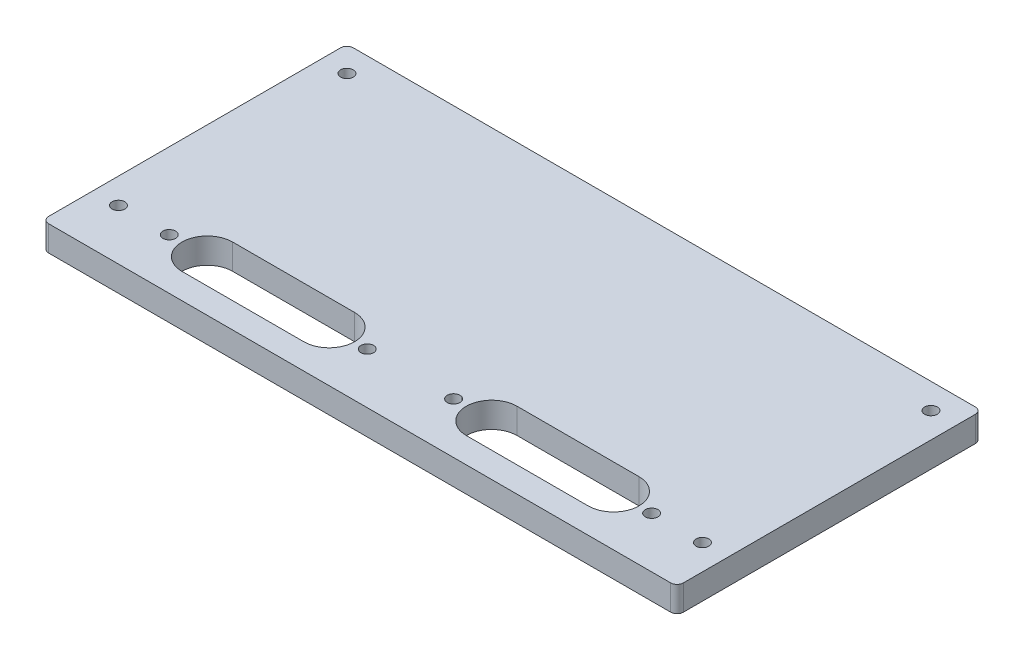
ISO-10303-21;
HEADER;
FILE_DESCRIPTION(('STEP AP214'),'2;1');
FILE_NAME('part.step','',(''),(''),'','','');
FILE_SCHEMA(('AUTOMOTIVE_DESIGN { 1 0 10303 214 1 1 1 1 }'));
ENDSEC;
DATA;
#1=APPLICATION_CONTEXT('core data for automotive mechanical design processes');
#2=APPLICATION_PROTOCOL_DEFINITION('international standard','automotive_design',2000,#1);
#3=PRODUCT_CONTEXT('',#1,'mechanical');
#4=PRODUCT('Part','Part','',(#3));
#5=PRODUCT_RELATED_PRODUCT_CATEGORY('part','',(#4));
#6=PRODUCT_DEFINITION_FORMATION('','',#4);
#7=PRODUCT_DEFINITION_CONTEXT('part definition',#1,'design');
#8=PRODUCT_DEFINITION('design','',#6,#7);
#9=PRODUCT_DEFINITION_SHAPE('','',#8);
#10=(LENGTH_UNIT() NAMED_UNIT(*) SI_UNIT(.MILLI.,.METRE.));
#11=(NAMED_UNIT(*) PLANE_ANGLE_UNIT() SI_UNIT($,.RADIAN.));
#12=(NAMED_UNIT(*) SI_UNIT($,.STERADIAN.) SOLID_ANGLE_UNIT());
#13=UNCERTAINTY_MEASURE_WITH_UNIT(LENGTH_MEASURE(1.E-05),#10,'distance_accuracy_value','');
#14=(GEOMETRIC_REPRESENTATION_CONTEXT(3) GLOBAL_UNCERTAINTY_ASSIGNED_CONTEXT((#13)) GLOBAL_UNIT_ASSIGNED_CONTEXT((#10,
#11,#12)) REPRESENTATION_CONTEXT('',''));
#15=CARTESIAN_POINT('',(0.,0.,0.));
#16=DIRECTION('',(0.,0.,1.));
#17=DIRECTION('',(1.,0.,0.));
#18=AXIS2_PLACEMENT_3D('',#15,#16,#17);
#19=CARTESIAN_POINT('',(0.,12.7,0.));
#20=DIRECTION('',(0.,-1.,0.));
#21=DIRECTION('',(0.,0.,-1.));
#22=AXIS2_PLACEMENT_3D('',#19,#20,#21);
#23=PLANE('',#22);
#24=CARTESIAN_POINT('',(137.16,12.7,-25.4));
#25=DIRECTION('',(0.,1.,0.));
#26=DIRECTION('',(0.,0.,1.));
#27=AXIS2_PLACEMENT_3D('',#24,#25,#26);
#28=CIRCLE('',#27,3.175);
#29=CARTESIAN_POINT('',(137.16,12.7,-22.225));
#30=VERTEX_POINT('',#29);
#31=EDGE_CURVE('E216',#30,#30,#28,.T.);
#32=ORIENTED_EDGE('',*,*,#31,.F.);
#33=EDGE_LOOP('',(#32));
#34=FACE_BOUND('',#33,.T.);
#35=CARTESIAN_POINT('',(38.1,12.7,-25.4));
#36=DIRECTION('',(0.,1.,0.));
#37=DIRECTION('',(0.,0.,1.));
#38=AXIS2_PLACEMENT_3D('',#35,#36,#37);
#39=CIRCLE('',#38,3.175);
#40=CARTESIAN_POINT('',(38.1,12.7,-22.225));
#41=VERTEX_POINT('',#40);
#42=EDGE_CURVE('E224',#41,#41,#39,.T.);
#43=ORIENTED_EDGE('',*,*,#42,.F.);
#44=EDGE_LOOP('',(#43));
#45=FACE_BOUND('',#44,.T.);
#46=CARTESIAN_POINT('',(57.15,12.7,-25.4));
#47=DIRECTION('',(0.,1.,0.));
#48=DIRECTION('',(0.,0.,1.));
#49=AXIS2_PLACEMENT_3D('',#46,#47,#48);
#50=CIRCLE('',#49,12.7);
#51=CARTESIAN_POINT('',(57.15,12.7,-38.1));
#52=VERTEX_POINT('',#51);
#53=CARTESIAN_POINT('',(57.15,12.7,-12.7));
#54=VERTEX_POINT('',#53);
#55=EDGE_CURVE('E232',#52,#54,#50,.T.);
#56=ORIENTED_EDGE('',*,*,#55,.F.);
#57=DIRECTION('',(-1.,0.,0.));
#58=VECTOR('',#57,1.);
#59=CARTESIAN_POINT('',(57.15,12.7,-38.1));
#60=LINE('',#59,#58);
#61=CARTESIAN_POINT('',(118.11,12.7,-38.1));
#62=VERTEX_POINT('',#61);
#63=EDGE_CURVE('E243',#62,#52,#60,.T.);
#64=ORIENTED_EDGE('',*,*,#63,.F.);
#65=CARTESIAN_POINT('',(118.11,12.7,-25.4));
#66=DIRECTION('',(0.,1.,0.));
#67=DIRECTION('',(0.,0.,1.));
#68=AXIS2_PLACEMENT_3D('',#65,#66,#67);
#69=CIRCLE('',#68,12.7);
#70=CARTESIAN_POINT('',(118.11,12.7,-12.7));
#71=VERTEX_POINT('',#70);
#72=EDGE_CURVE('E239',#71,#62,#69,.T.);
#73=ORIENTED_EDGE('',*,*,#72,.F.);
#74=DIRECTION('',(1.,0.,0.));
#75=VECTOR('',#74,1.);
#76=CARTESIAN_POINT('',(57.15,12.7,-12.7));
#77=LINE('',#76,#75);
#78=EDGE_CURVE('E235',#54,#71,#77,.T.);
#79=ORIENTED_EDGE('',*,*,#78,.F.);
#80=EDGE_LOOP('',(#56,#64,#73,#79));
#81=FACE_BOUND('',#80,.T.);
#82=DIRECTION('',(-1.,0.,0.));
#83=VECTOR('',#82,1.);
#84=CARTESIAN_POINT('',(0.,12.7,-152.4));
#85=LINE('',#84,#83);
#86=CARTESIAN_POINT('',(314.325,12.7,-152.4));
#87=VERTEX_POINT('',#86);
#88=CARTESIAN_POINT('',(3.175,12.7,-152.4));
#89=VERTEX_POINT('',#88);
#90=EDGE_CURVE('E318',#87,#89,#85,.T.);
#91=ORIENTED_EDGE('',*,*,#90,.T.);
#92=CARTESIAN_POINT('',(3.175,12.7,-149.225));
#93=DIRECTION('',(0.,-1.,0.));
#94=DIRECTION('',(0.,0.,-1.));
#95=AXIS2_PLACEMENT_3D('',#92,#93,#94);
#96=CIRCLE('',#95,3.175);
#97=CARTESIAN_POINT('',(0.,12.7,-149.225));
#98=VERTEX_POINT('',#97);
#99=EDGE_CURVE('E369',#89,#98,#96,.F.);
#100=ORIENTED_EDGE('',*,*,#99,.T.);
#101=DIRECTION('',(0.,0.,1.));
#102=VECTOR('',#101,1.);
#103=CARTESIAN_POINT('',(0.,12.7,0.));
#104=LINE('',#103,#102);
#105=CARTESIAN_POINT('',(0.,12.7,-3.175));
#106=VERTEX_POINT('',#105);
#107=EDGE_CURVE('E307',#98,#106,#104,.T.);
#108=ORIENTED_EDGE('',*,*,#107,.T.);
#109=CARTESIAN_POINT('',(3.175,12.7,-3.175));
#110=DIRECTION('',(0.,-1.,0.));
#111=DIRECTION('',(0.,0.,-1.));
#112=AXIS2_PLACEMENT_3D('',#109,#110,#111);
#113=CIRCLE('',#112,3.175);
#114=CARTESIAN_POINT('',(3.175,12.7,0.));
#115=VERTEX_POINT('',#114);
#116=EDGE_CURVE('E366',#106,#115,#113,.F.);
#117=ORIENTED_EDGE('',*,*,#116,.T.);
#118=DIRECTION('',(1.,0.,0.));
#119=VECTOR('',#118,1.);
#120=CARTESIAN_POINT('',(0.,12.7,0.));
#121=LINE('',#120,#119);
#122=CARTESIAN_POINT('',(314.325,12.7,0.));
#123=VERTEX_POINT('',#122);
#124=EDGE_CURVE('E311',#115,#123,#121,.T.);
#125=ORIENTED_EDGE('',*,*,#124,.T.);
#126=CARTESIAN_POINT('',(314.325,12.7,-3.17500000000004));
#127=DIRECTION('',(0.,-1.,0.));
#128=DIRECTION('',(0.,0.,-1.));
#129=AXIS2_PLACEMENT_3D('',#126,#127,#128);
#130=CIRCLE('',#129,3.175);
#131=CARTESIAN_POINT('',(317.5,12.7,-3.17500000000004));
#132=VERTEX_POINT('',#131);
#133=EDGE_CURVE('E66',#123,#132,#130,.F.);
#134=ORIENTED_EDGE('',*,*,#133,.T.);
#135=DIRECTION('',(0.,0.,-1.));
#136=VECTOR('',#135,1.);
#137=CARTESIAN_POINT('',(317.5,12.7,0.));
#138=LINE('',#137,#136);
#139=CARTESIAN_POINT('',(317.5,12.7,-149.225));
#140=VERTEX_POINT('',#139);
#141=EDGE_CURVE('E315',#132,#140,#138,.T.);
#142=ORIENTED_EDGE('',*,*,#141,.T.);
#143=CARTESIAN_POINT('',(314.325,12.7,-149.225));
#144=DIRECTION('',(0.,-1.,0.));
#145=DIRECTION('',(0.,0.,-1.));
#146=AXIS2_PLACEMENT_3D('',#143,#144,#145);
#147=CIRCLE('',#146,3.175);
#148=EDGE_CURVE('E363',#140,#87,#147,.F.);
#149=ORIENTED_EDGE('',*,*,#148,.T.);
#150=EDGE_LOOP('',(#91,#100,#108,#117,#125,#134,#142,#149));
#151=FACE_BOUND('',#150,.T.);
#152=CARTESIAN_POINT('',(12.7,12.7,-25.4));
#153=DIRECTION('',(0.,1.,0.));
#154=DIRECTION('',(0.,0.,1.));
#155=AXIS2_PLACEMENT_3D('',#152,#153,#154);
#156=CIRCLE('',#155,3.175);
#157=CARTESIAN_POINT('',(12.7,12.7,-22.225));
#158=VERTEX_POINT('',#157);
#159=EDGE_CURVE('E299',#158,#158,#156,.T.);
#160=ORIENTED_EDGE('',*,*,#159,.F.);
#161=EDGE_LOOP('',(#160));
#162=FACE_BOUND('',#161,.T.);
#163=CARTESIAN_POINT('',(12.7,12.7,-139.7));
#164=DIRECTION('',(0.,1.,0.));
#165=DIRECTION('',(0.,0.,1.));
#166=AXIS2_PLACEMENT_3D('',#163,#164,#165);
#167=CIRCLE('',#166,3.175);
#168=CARTESIAN_POINT('',(12.7,12.7,-136.525));
#169=VERTEX_POINT('',#168);
#170=EDGE_CURVE('E291',#169,#169,#167,.T.);
#171=ORIENTED_EDGE('',*,*,#170,.F.);
#172=EDGE_LOOP('',(#171));
#173=FACE_BOUND('',#172,.T.);
#174=CARTESIAN_POINT('',(304.8,12.7,-139.7));
#175=DIRECTION('',(0.,1.,0.));
#176=DIRECTION('',(0.,0.,1.));
#177=AXIS2_PLACEMENT_3D('',#174,#175,#176);
#178=CIRCLE('',#177,3.17499999999997);
#179=CARTESIAN_POINT('',(304.8,12.7,-136.525));
#180=VERTEX_POINT('',#179);
#181=EDGE_CURVE('E283',#180,#180,#178,.T.);
#182=ORIENTED_EDGE('',*,*,#181,.F.);
#183=EDGE_LOOP('',(#182));
#184=FACE_BOUND('',#183,.T.);
#185=CARTESIAN_POINT('',(304.8,12.7,-25.4));
#186=DIRECTION('',(0.,1.,0.));
#187=DIRECTION('',(0.,0.,1.));
#188=AXIS2_PLACEMENT_3D('',#185,#186,#187);
#189=CIRCLE('',#188,3.17499999999997);
#190=CARTESIAN_POINT('',(304.8,12.7,-22.225));
#191=VERTEX_POINT('',#190);
#192=EDGE_CURVE('E275',#191,#191,#189,.T.);
#193=ORIENTED_EDGE('',*,*,#192,.F.);
#194=EDGE_LOOP('',(#193));
#195=FACE_BOUND('',#194,.T.);
#196=CARTESIAN_POINT('',(260.35,12.7,-25.4));
#197=DIRECTION('',(0.,1.,0.));
#198=DIRECTION('',(0.,0.,-1.));
#199=AXIS2_PLACEMENT_3D('',#196,#197,#198);
#200=CIRCLE('',#199,12.7);
#201=CARTESIAN_POINT('',(260.35,12.7,-12.7));
#202=VERTEX_POINT('',#201);
#203=CARTESIAN_POINT('',(260.35,12.7,-38.1));
#204=VERTEX_POINT('',#203);
#205=EDGE_CURVE('E160',#202,#204,#200,.T.);
#206=ORIENTED_EDGE('',*,*,#205,.F.);
#207=DIRECTION('',(1.,0.,0.));
#208=VECTOR('',#207,1.);
#209=CARTESIAN_POINT('',(260.35,12.7,-12.7));
#210=LINE('',#209,#208);
#211=CARTESIAN_POINT('',(199.39,12.7,-12.7));
#212=VERTEX_POINT('',#211);
#213=EDGE_CURVE('E190',#212,#202,#210,.T.);
#214=ORIENTED_EDGE('',*,*,#213,.F.);
#215=CARTESIAN_POINT('',(199.39,12.7,-25.4));
#216=DIRECTION('',(0.,1.,0.));
#217=DIRECTION('',(0.,0.,-1.));
#218=AXIS2_PLACEMENT_3D('',#215,#216,#217);
#219=CIRCLE('',#218,12.7);
#220=CARTESIAN_POINT('',(199.39,12.7,-38.1));
#221=VERTEX_POINT('',#220);
#222=EDGE_CURVE('E186',#221,#212,#219,.T.);
#223=ORIENTED_EDGE('',*,*,#222,.F.);
#224=DIRECTION('',(-1.,0.,0.));
#225=VECTOR('',#224,1.);
#226=CARTESIAN_POINT('',(260.35,12.7,-38.1));
#227=LINE('',#226,#225);
#228=EDGE_CURVE('E171',#204,#221,#227,.T.);
#229=ORIENTED_EDGE('',*,*,#228,.F.);
#230=EDGE_LOOP('',(#206,#214,#223,#229));
#231=FACE_BOUND('',#230,.T.);
#232=CARTESIAN_POINT('',(180.34,12.7,-25.4));
#233=DIRECTION('',(0.,1.,0.));
#234=DIRECTION('',(0.,0.,-1.));
#235=AXIS2_PLACEMENT_3D('',#232,#233,#234);
#236=CIRCLE('',#235,3.175);
#237=CARTESIAN_POINT('',(180.34,12.7,-28.575));
#238=VERTEX_POINT('',#237);
#239=EDGE_CURVE('E199',#238,#238,#236,.T.);
#240=ORIENTED_EDGE('',*,*,#239,.F.);
#241=EDGE_LOOP('',(#240));
#242=FACE_BOUND('',#241,.T.);
#243=CARTESIAN_POINT('',(279.4,12.7,-25.4));
#244=DIRECTION('',(0.,1.,0.));
#245=DIRECTION('',(0.,0.,-1.));
#246=AXIS2_PLACEMENT_3D('',#243,#244,#245);
#247=CIRCLE('',#246,3.17500000000003);
#248=CARTESIAN_POINT('',(279.4,12.7,-28.5750000000001));
#249=VERTEX_POINT('',#248);
#250=EDGE_CURVE('E678',#249,#249,#247,.T.);
#251=ORIENTED_EDGE('',*,*,#250,.F.);
#252=EDGE_LOOP('',(#251));
#253=FACE_BOUND('',#252,.T.);
#254=ADVANCED_FACE('F45',(#34,#45,#81,#151,#162,#173,#184,#195,#231,#242,#253),#23,.F.);
#255=CARTESIAN_POINT('',(0.,0.,0.));
#256=DIRECTION('',(0.,-1.,0.));
#257=DIRECTION('',(0.,0.,-1.));
#258=AXIS2_PLACEMENT_3D('',#255,#256,#257);
#259=PLANE('',#258);
#260=CARTESIAN_POINT('',(180.34,0.,-25.4));
#261=DIRECTION('',(0.,1.,0.));
#262=DIRECTION('',(0.,0.,-1.));
#263=AXIS2_PLACEMENT_3D('',#260,#261,#262);
#264=CIRCLE('',#263,3.175);
#265=CARTESIAN_POINT('',(180.34,0.,-28.575));
#266=VERTEX_POINT('',#265);
#267=EDGE_CURVE('E682',#266,#266,#264,.T.);
#268=ORIENTED_EDGE('',*,*,#267,.T.);
#269=EDGE_LOOP('',(#268));
#270=FACE_BOUND('',#269,.T.);
#271=CARTESIAN_POINT('',(38.1,0.,-25.4));
#272=DIRECTION('',(0.,1.,0.));
#273=DIRECTION('',(0.,0.,1.));
#274=AXIS2_PLACEMENT_3D('',#271,#272,#273);
#275=CIRCLE('',#274,3.175);
#276=CARTESIAN_POINT('',(38.1,0.,-22.225));
#277=VERTEX_POINT('',#276);
#278=EDGE_CURVE('E220',#277,#277,#275,.T.);
#279=ORIENTED_EDGE('',*,*,#278,.T.);
#280=EDGE_LOOP('',(#279));
#281=FACE_BOUND('',#280,.T.);
#282=CARTESIAN_POINT('',(304.8,0.,-139.7));
#283=DIRECTION('',(0.,1.,0.));
#284=DIRECTION('',(0.,0.,1.));
#285=AXIS2_PLACEMENT_3D('',#282,#283,#284);
#286=CIRCLE('',#285,3.17499999999997);
#287=CARTESIAN_POINT('',(304.8,0.,-136.525));
#288=VERTEX_POINT('',#287);
#289=EDGE_CURVE('E279',#288,#288,#286,.T.);
#290=ORIENTED_EDGE('',*,*,#289,.T.);
#291=EDGE_LOOP('',(#290));
#292=FACE_BOUND('',#291,.T.);
#293=CARTESIAN_POINT('',(12.7,0.,-25.4));
#294=DIRECTION('',(0.,1.,0.));
#295=DIRECTION('',(0.,0.,1.));
#296=AXIS2_PLACEMENT_3D('',#293,#294,#295);
#297=CIRCLE('',#296,3.175);
#298=CARTESIAN_POINT('',(12.7,0.,-22.225));
#299=VERTEX_POINT('',#298);
#300=EDGE_CURVE('E295',#299,#299,#297,.T.);
#301=ORIENTED_EDGE('',*,*,#300,.T.);
#302=EDGE_LOOP('',(#301));
#303=FACE_BOUND('',#302,.T.);
#304=DIRECTION('',(0.,0.,1.));
#305=VECTOR('',#304,1.);
#306=CARTESIAN_POINT('',(0.,0.,0.));
#307=LINE('',#306,#305);
#308=CARTESIAN_POINT('',(0.,0.,-149.225));
#309=VERTEX_POINT('',#308);
#310=CARTESIAN_POINT('',(0.,0.,-3.175));
#311=VERTEX_POINT('',#310);
#312=EDGE_CURVE('E303',#309,#311,#307,.T.);
#313=ORIENTED_EDGE('',*,*,#312,.F.);
#314=CARTESIAN_POINT('',(3.175,0.,-149.225));
#315=DIRECTION('',(0.,-1.,0.));
#316=DIRECTION('',(0.,0.,-1.));
#317=AXIS2_PLACEMENT_3D('',#314,#315,#316);
#318=CIRCLE('',#317,3.175);
#319=CARTESIAN_POINT('',(3.175,0.,-152.4));
#320=VERTEX_POINT('',#319);
#321=EDGE_CURVE('E351',#309,#320,#318,.T.);
#322=ORIENTED_EDGE('',*,*,#321,.T.);
#323=DIRECTION('',(-1.,0.,0.));
#324=VECTOR('',#323,1.);
#325=CARTESIAN_POINT('',(0.,0.,-152.4));
#326=LINE('',#325,#324);
#327=CARTESIAN_POINT('',(314.325,0.,-152.4));
#328=VERTEX_POINT('',#327);
#329=EDGE_CURVE('E312',#328,#320,#326,.T.);
#330=ORIENTED_EDGE('',*,*,#329,.F.);
#331=CARTESIAN_POINT('',(314.325,0.,-149.225));
#332=DIRECTION('',(0.,-1.,0.));
#333=DIRECTION('',(0.,0.,-1.));
#334=AXIS2_PLACEMENT_3D('',#331,#332,#333);
#335=CIRCLE('',#334,3.175);
#336=CARTESIAN_POINT('',(317.5,0.,-149.225));
#337=VERTEX_POINT('',#336);
#338=EDGE_CURVE('E345',#328,#337,#335,.T.);
#339=ORIENTED_EDGE('',*,*,#338,.T.);
#340=DIRECTION('',(0.,0.,-1.));
#341=VECTOR('',#340,1.);
#342=CARTESIAN_POINT('',(317.5,0.,0.));
#343=LINE('',#342,#341);
#344=CARTESIAN_POINT('',(317.5,0.,-3.17500000000004));
#345=VERTEX_POINT('',#344);
#346=EDGE_CURVE('E330',#345,#337,#343,.T.);
#347=ORIENTED_EDGE('',*,*,#346,.F.);
#348=CARTESIAN_POINT('',(314.325,0.,-3.17500000000004));
#349=DIRECTION('',(0.,-1.,0.));
#350=DIRECTION('',(0.,0.,-1.));
#351=AXIS2_PLACEMENT_3D('',#348,#349,#350);
#352=CIRCLE('',#351,3.175);
#353=CARTESIAN_POINT('',(314.325,0.,0.));
#354=VERTEX_POINT('',#353);
#355=EDGE_CURVE('E342',#345,#354,#352,.T.);
#356=ORIENTED_EDGE('',*,*,#355,.T.);
#357=DIRECTION('',(1.,0.,0.));
#358=VECTOR('',#357,1.);
#359=CARTESIAN_POINT('',(0.,0.,0.));
#360=LINE('',#359,#358);
#361=CARTESIAN_POINT('',(3.175,0.,0.));
#362=VERTEX_POINT('',#361);
#363=EDGE_CURVE('E326',#362,#354,#360,.T.);
#364=ORIENTED_EDGE('',*,*,#363,.F.);
#365=CARTESIAN_POINT('',(3.175,0.,-3.175));
#366=DIRECTION('',(0.,-1.,0.));
#367=DIRECTION('',(0.,0.,-1.));
#368=AXIS2_PLACEMENT_3D('',#365,#366,#367);
#369=CIRCLE('',#368,3.175);
#370=EDGE_CURVE('E348',#362,#311,#369,.T.);
#371=ORIENTED_EDGE('',*,*,#370,.T.);
#372=EDGE_LOOP('',(#313,#322,#330,#339,#347,#356,#364,#371));
#373=FACE_BOUND('',#372,.T.);
#374=CARTESIAN_POINT('',(12.7,0.,-139.7));
#375=DIRECTION('',(0.,1.,0.));
#376=DIRECTION('',(0.,0.,1.));
#377=AXIS2_PLACEMENT_3D('',#374,#375,#376);
#378=CIRCLE('',#377,3.175);
#379=CARTESIAN_POINT('',(12.7,0.,-136.525));
#380=VERTEX_POINT('',#379);
#381=EDGE_CURVE('E287',#380,#380,#378,.T.);
#382=ORIENTED_EDGE('',*,*,#381,.T.);
#383=EDGE_LOOP('',(#382));
#384=FACE_BOUND('',#383,.T.);
#385=CARTESIAN_POINT('',(304.8,0.,-25.4));
#386=DIRECTION('',(0.,1.,0.));
#387=DIRECTION('',(0.,0.,1.));
#388=AXIS2_PLACEMENT_3D('',#385,#386,#387);
#389=CIRCLE('',#388,3.17499999999997);
#390=CARTESIAN_POINT('',(304.8,0.,-22.225));
#391=VERTEX_POINT('',#390);
#392=EDGE_CURVE('E274',#391,#391,#389,.T.);
#393=ORIENTED_EDGE('',*,*,#392,.T.);
#394=EDGE_LOOP('',(#393));
#395=FACE_BOUND('',#394,.T.);
#396=DIRECTION('',(-1.,0.,0.));
#397=VECTOR('',#396,1.);
#398=CARTESIAN_POINT('',(57.15,0.,-38.1));
#399=LINE('',#398,#397);
#400=CARTESIAN_POINT('',(118.11,0.,-38.1));
#401=VERTEX_POINT('',#400);
#402=CARTESIAN_POINT('',(57.15,0.,-38.1));
#403=VERTEX_POINT('',#402);
#404=EDGE_CURVE('E236',#401,#403,#399,.T.);
#405=ORIENTED_EDGE('',*,*,#404,.T.);
#406=CARTESIAN_POINT('',(57.15,0.,-25.4));
#407=DIRECTION('',(0.,1.,0.));
#408=DIRECTION('',(0.,0.,1.));
#409=AXIS2_PLACEMENT_3D('',#406,#407,#408);
#410=CIRCLE('',#409,12.7);
#411=CARTESIAN_POINT('',(57.15,0.,-12.7));
#412=VERTEX_POINT('',#411);
#413=EDGE_CURVE('E228',#403,#412,#410,.T.);
#414=ORIENTED_EDGE('',*,*,#413,.T.);
#415=DIRECTION('',(1.,0.,0.));
#416=VECTOR('',#415,1.);
#417=CARTESIAN_POINT('',(57.15,0.,-12.7));
#418=LINE('',#417,#416);
#419=CARTESIAN_POINT('',(118.11,0.,-12.7));
#420=VERTEX_POINT('',#419);
#421=EDGE_CURVE('E250',#412,#420,#418,.T.);
#422=ORIENTED_EDGE('',*,*,#421,.T.);
#423=CARTESIAN_POINT('',(118.11,0.,-25.4));
#424=DIRECTION('',(0.,1.,0.));
#425=DIRECTION('',(0.,0.,1.));
#426=AXIS2_PLACEMENT_3D('',#423,#424,#425);
#427=CIRCLE('',#426,12.7);
#428=EDGE_CURVE('E254',#420,#401,#427,.T.);
#429=ORIENTED_EDGE('',*,*,#428,.T.);
#430=EDGE_LOOP('',(#405,#414,#422,#429));
#431=FACE_BOUND('',#430,.T.);
#432=CARTESIAN_POINT('',(137.16,0.,-25.4));
#433=DIRECTION('',(0.,1.,0.));
#434=DIRECTION('',(0.,0.,1.));
#435=AXIS2_PLACEMENT_3D('',#432,#433,#434);
#436=CIRCLE('',#435,3.175);
#437=CARTESIAN_POINT('',(137.16,0.,-22.225));
#438=VERTEX_POINT('',#437);
#439=EDGE_CURVE('E180',#438,#438,#436,.T.);
#440=ORIENTED_EDGE('',*,*,#439,.T.);
#441=EDGE_LOOP('',(#440));
#442=FACE_BOUND('',#441,.T.);
#443=DIRECTION('',(1.,0.,0.));
#444=VECTOR('',#443,1.);
#445=CARTESIAN_POINT('',(260.35,0.,-12.7));
#446=LINE('',#445,#444);
#447=CARTESIAN_POINT('',(199.39,0.,-12.7));
#448=VERTEX_POINT('',#447);
#449=CARTESIAN_POINT('',(260.35,0.,-12.7));
#450=VERTEX_POINT('',#449);
#451=EDGE_CURVE('E172',#448,#450,#446,.T.);
#452=ORIENTED_EDGE('',*,*,#451,.T.);
#453=CARTESIAN_POINT('',(260.35,0.,-25.4));
#454=DIRECTION('',(0.,1.,0.));
#455=DIRECTION('',(0.,0.,-1.));
#456=AXIS2_PLACEMENT_3D('',#453,#454,#455);
#457=CIRCLE('',#456,12.7);
#458=CARTESIAN_POINT('',(260.35,0.,-38.1));
#459=VERTEX_POINT('',#458);
#460=EDGE_CURVE('E196',#450,#459,#457,.T.);
#461=ORIENTED_EDGE('',*,*,#460,.T.);
#462=DIRECTION('',(-1.,0.,0.));
#463=VECTOR('',#462,1.);
#464=CARTESIAN_POINT('',(260.35,0.,-38.1));
#465=LINE('',#464,#463);
#466=CARTESIAN_POINT('',(199.39,0.,-38.1));
#467=VERTEX_POINT('',#466);
#468=EDGE_CURVE('E178',#459,#467,#465,.T.);
#469=ORIENTED_EDGE('',*,*,#468,.T.);
#470=CARTESIAN_POINT('',(199.39,0.,-25.4));
#471=DIRECTION('',(0.,1.,0.));
#472=DIRECTION('',(0.,0.,-1.));
#473=AXIS2_PLACEMENT_3D('',#470,#471,#472);
#474=CIRCLE('',#473,12.7);
#475=EDGE_CURVE('E202',#467,#448,#474,.T.);
#476=ORIENTED_EDGE('',*,*,#475,.T.);
#477=EDGE_LOOP('',(#452,#461,#469,#476));
#478=FACE_BOUND('',#477,.T.);
#479=CARTESIAN_POINT('',(279.4,0.,-25.4));
#480=DIRECTION('',(0.,1.,0.));
#481=DIRECTION('',(0.,0.,-1.));
#482=AXIS2_PLACEMENT_3D('',#479,#480,#481);
#483=CIRCLE('',#482,3.17500000000003);
#484=CARTESIAN_POINT('',(279.4,0.,-28.5750000000001));
#485=VERTEX_POINT('',#484);
#486=EDGE_CURVE('E675',#485,#485,#483,.T.);
#487=ORIENTED_EDGE('',*,*,#486,.T.);
#488=EDGE_LOOP('',(#487));
#489=FACE_BOUND('',#488,.T.);
#490=ADVANCED_FACE('F386',(#270,#281,#292,#303,#373,#384,#395,#431,#442,#478,#489),#259,.T.);
#491=CARTESIAN_POINT('',(0.,12.7,0.));
#492=DIRECTION('',(1.,0.,0.));
#493=DIRECTION('',(0.,0.,-1.));
#494=AXIS2_PLACEMENT_3D('',#491,#492,#493);
#495=PLANE('',#494);
#496=ORIENTED_EDGE('',*,*,#107,.F.);
#497=DIRECTION('',(0.,-1.,0.));
#498=VECTOR('',#497,1.);
#499=CARTESIAN_POINT('',(0.,12.7,-149.225));
#500=LINE('',#499,#498);
#501=EDGE_CURVE('E338',#98,#309,#500,.T.);
#502=ORIENTED_EDGE('',*,*,#501,.T.);
#503=ORIENTED_EDGE('',*,*,#312,.T.);
#504=DIRECTION('',(0.,-1.,0.));
#505=VECTOR('',#504,1.);
#506=CARTESIAN_POINT('',(0.,12.7,-3.175));
#507=LINE('',#506,#505);
#508=EDGE_CURVE('E322',#311,#106,#507,.F.);
#509=ORIENTED_EDGE('',*,*,#508,.T.);
#510=EDGE_LOOP('',(#496,#502,#503,#509));
#511=FACE_BOUND('',#510,.T.);
#512=ADVANCED_FACE('F405',(#511),#495,.F.);
#513=CARTESIAN_POINT('',(0.,12.7,0.));
#514=DIRECTION('',(0.,0.,-1.));
#515=DIRECTION('',(-1.,0.,0.));
#516=AXIS2_PLACEMENT_3D('',#513,#514,#515);
#517=PLANE('',#516);
#518=ORIENTED_EDGE('',*,*,#124,.F.);
#519=DIRECTION('',(0.,-1.,0.));
#520=VECTOR('',#519,1.);
#521=CARTESIAN_POINT('',(3.175,12.7,0.));
#522=LINE('',#521,#520);
#523=EDGE_CURVE('E375',#115,#362,#522,.T.);
#524=ORIENTED_EDGE('',*,*,#523,.T.);
#525=ORIENTED_EDGE('',*,*,#363,.T.);
#526=DIRECTION('',(0.,-1.,0.));
#527=VECTOR('',#526,1.);
#528=CARTESIAN_POINT('',(314.325,12.7,0.));
#529=LINE('',#528,#527);
#530=EDGE_CURVE('E372',#354,#123,#529,.F.);
#531=ORIENTED_EDGE('',*,*,#530,.T.);
#532=EDGE_LOOP('',(#518,#524,#525,#531));
#533=FACE_BOUND('',#532,.T.);
#534=ADVANCED_FACE('F413',(#533),#517,.F.);
#535=CARTESIAN_POINT('',(317.5,12.7,0.));
#536=DIRECTION('',(-1.,0.,0.));
#537=DIRECTION('',(0.,0.,1.));
#538=AXIS2_PLACEMENT_3D('',#535,#536,#537);
#539=PLANE('',#538);
#540=ORIENTED_EDGE('',*,*,#346,.T.);
#541=DIRECTION('',(0.,-1.,0.));
#542=VECTOR('',#541,1.);
#543=CARTESIAN_POINT('',(317.5,12.7,-149.225));
#544=LINE('',#543,#542);
#545=EDGE_CURVE('E11',#337,#140,#544,.F.);
#546=ORIENTED_EDGE('',*,*,#545,.T.);
#547=ORIENTED_EDGE('',*,*,#141,.F.);
#548=DIRECTION('',(0.,-1.,0.));
#549=VECTOR('',#548,1.);
#550=CARTESIAN_POINT('',(317.5,12.7,-3.17500000000004));
#551=LINE('',#550,#549);
#552=EDGE_CURVE('E54',#132,#345,#551,.T.);
#553=ORIENTED_EDGE('',*,*,#552,.T.);
#554=EDGE_LOOP('',(#540,#546,#547,#553));
#555=FACE_BOUND('',#554,.T.);
#556=ADVANCED_FACE('F382',(#555),#539,.F.);
#557=CARTESIAN_POINT('',(0.,12.7,-152.4));
#558=DIRECTION('',(0.,0.,1.));
#559=DIRECTION('',(1.,0.,0.));
#560=AXIS2_PLACEMENT_3D('',#557,#558,#559);
#561=PLANE('',#560);
#562=ORIENTED_EDGE('',*,*,#329,.T.);
#563=DIRECTION('',(0.,-1.,0.));
#564=VECTOR('',#563,1.);
#565=CARTESIAN_POINT('',(3.175,12.7,-152.4));
#566=LINE('',#565,#564);
#567=EDGE_CURVE('E358',#320,#89,#566,.F.);
#568=ORIENTED_EDGE('',*,*,#567,.T.);
#569=ORIENTED_EDGE('',*,*,#90,.F.);
#570=DIRECTION('',(0.,-1.,0.));
#571=VECTOR('',#570,1.);
#572=CARTESIAN_POINT('',(314.325,12.7,-152.4));
#573=LINE('',#572,#571);
#574=EDGE_CURVE('E354',#87,#328,#573,.T.);
#575=ORIENTED_EDGE('',*,*,#574,.T.);
#576=EDGE_LOOP('',(#562,#568,#569,#575));
#577=FACE_BOUND('',#576,.T.);
#578=ADVANCED_FACE('F396',(#577),#561,.F.);
#579=CARTESIAN_POINT('',(12.7,12.7,-25.4));
#580=DIRECTION('',(0.,-1.,0.));
#581=DIRECTION('',(0.,0.,-1.));
#582=AXIS2_PLACEMENT_3D('',#579,#580,#581);
#583=CYLINDRICAL_SURFACE('',#582,3.175);
#584=ORIENTED_EDGE('',*,*,#159,.T.);
#585=EDGE_LOOP('',(#584));
#586=FACE_BOUND('',#585,.T.);
#587=ORIENTED_EDGE('',*,*,#300,.F.);
#588=EDGE_LOOP('',(#587));
#589=FACE_BOUND('',#588,.T.);
#590=ADVANCED_FACE('F431',(#586,#589),#583,.F.);
#591=CARTESIAN_POINT('',(12.7,12.7,-139.7));
#592=DIRECTION('',(0.,-1.,0.));
#593=DIRECTION('',(0.,0.,-1.));
#594=AXIS2_PLACEMENT_3D('',#591,#592,#593);
#595=CYLINDRICAL_SURFACE('',#594,3.175);
#596=ORIENTED_EDGE('',*,*,#170,.T.);
#597=EDGE_LOOP('',(#596));
#598=FACE_BOUND('',#597,.T.);
#599=ORIENTED_EDGE('',*,*,#381,.F.);
#600=EDGE_LOOP('',(#599));
#601=FACE_BOUND('',#600,.T.);
#602=ADVANCED_FACE('F585',(#598,#601),#595,.F.);
#603=CARTESIAN_POINT('',(304.8,12.7,-139.7));
#604=DIRECTION('',(0.,-1.,0.));
#605=DIRECTION('',(0.,0.,-1.));
#606=AXIS2_PLACEMENT_3D('',#603,#604,#605);
#607=CYLINDRICAL_SURFACE('',#606,3.17499999999997);
#608=ORIENTED_EDGE('',*,*,#181,.T.);
#609=EDGE_LOOP('',(#608));
#610=FACE_BOUND('',#609,.T.);
#611=ORIENTED_EDGE('',*,*,#289,.F.);
#612=EDGE_LOOP('',(#611));
#613=FACE_BOUND('',#612,.T.);
#614=ADVANCED_FACE('F576',(#610,#613),#607,.F.);
#615=CARTESIAN_POINT('',(304.8,12.7,-25.4));
#616=DIRECTION('',(0.,-1.,0.));
#617=DIRECTION('',(0.,0.,-1.));
#618=AXIS2_PLACEMENT_3D('',#615,#616,#617);
#619=CYLINDRICAL_SURFACE('',#618,3.17499999999997);
#620=ORIENTED_EDGE('',*,*,#192,.T.);
#621=EDGE_LOOP('',(#620));
#622=FACE_BOUND('',#621,.T.);
#623=ORIENTED_EDGE('',*,*,#392,.F.);
#624=EDGE_LOOP('',(#623));
#625=FACE_BOUND('',#624,.T.);
#626=ADVANCED_FACE('F567',(#622,#625),#619,.F.);
#627=CARTESIAN_POINT('',(57.15,12.7,-25.4));
#628=DIRECTION('',(0.,-1.,0.));
#629=DIRECTION('',(0.,0.,-1.));
#630=AXIS2_PLACEMENT_3D('',#627,#628,#629);
#631=CYLINDRICAL_SURFACE('',#630,12.7);
#632=ORIENTED_EDGE('',*,*,#413,.F.);
#633=DIRECTION('',(0.,-1.,0.));
#634=VECTOR('',#633,1.);
#635=CARTESIAN_POINT('',(57.15,12.7,-38.1));
#636=LINE('',#635,#634);
#637=EDGE_CURVE('E246',#52,#403,#636,.T.);
#638=ORIENTED_EDGE('',*,*,#637,.F.);
#639=ORIENTED_EDGE('',*,*,#55,.T.);
#640=DIRECTION('',(0.,-1.,0.));
#641=VECTOR('',#640,1.);
#642=CARTESIAN_POINT('',(57.15,12.7,-12.7));
#643=LINE('',#642,#641);
#644=EDGE_CURVE('E270',#54,#412,#643,.T.);
#645=ORIENTED_EDGE('',*,*,#644,.T.);
#646=EDGE_LOOP('',(#632,#638,#639,#645));
#647=FACE_BOUND('',#646,.T.);
#648=ADVANCED_FACE('F558',(#647),#631,.F.);
#649=CARTESIAN_POINT('',(57.15,12.7,-12.7));
#650=DIRECTION('',(0.,0.,-1.));
#651=DIRECTION('',(-1.,0.,0.));
#652=AXIS2_PLACEMENT_3D('',#649,#650,#651);
#653=PLANE('',#652);
#654=ORIENTED_EDGE('',*,*,#421,.F.);
#655=ORIENTED_EDGE('',*,*,#644,.F.);
#656=ORIENTED_EDGE('',*,*,#78,.T.);
#657=DIRECTION('',(0.,-1.,0.));
#658=VECTOR('',#657,1.);
#659=CARTESIAN_POINT('',(118.11,12.7,-12.7));
#660=LINE('',#659,#658);
#661=EDGE_CURVE('E267',#71,#420,#660,.T.);
#662=ORIENTED_EDGE('',*,*,#661,.T.);
#663=EDGE_LOOP('',(#654,#655,#656,#662));
#664=FACE_BOUND('',#663,.T.);
#665=ADVANCED_FACE('F549',(#664),#653,.T.);
#666=CARTESIAN_POINT('',(118.11,12.7,-25.4));
#667=DIRECTION('',(0.,-1.,0.));
#668=DIRECTION('',(0.,0.,-1.));
#669=AXIS2_PLACEMENT_3D('',#666,#667,#668);
#670=CYLINDRICAL_SURFACE('',#669,12.7);
#671=ORIENTED_EDGE('',*,*,#428,.F.);
#672=ORIENTED_EDGE('',*,*,#661,.F.);
#673=ORIENTED_EDGE('',*,*,#72,.T.);
#674=DIRECTION('',(0.,-1.,0.));
#675=VECTOR('',#674,1.);
#676=CARTESIAN_POINT('',(118.11,12.7,-38.1));
#677=LINE('',#676,#675);
#678=EDGE_CURVE('E264',#62,#401,#677,.T.);
#679=ORIENTED_EDGE('',*,*,#678,.T.);
#680=EDGE_LOOP('',(#671,#672,#673,#679));
#681=FACE_BOUND('',#680,.T.);
#682=ADVANCED_FACE('F540',(#681),#670,.F.);
#683=CARTESIAN_POINT('',(57.15,12.7,-38.1));
#684=DIRECTION('',(0.,0.,1.));
#685=DIRECTION('',(1.,0.,0.));
#686=AXIS2_PLACEMENT_3D('',#683,#684,#685);
#687=PLANE('',#686);
#688=ORIENTED_EDGE('',*,*,#404,.F.);
#689=ORIENTED_EDGE('',*,*,#678,.F.);
#690=ORIENTED_EDGE('',*,*,#63,.T.);
#691=ORIENTED_EDGE('',*,*,#637,.T.);
#692=EDGE_LOOP('',(#688,#689,#690,#691));
#693=FACE_BOUND('',#692,.T.);
#694=ADVANCED_FACE('F531',(#693),#687,.T.);
#695=CARTESIAN_POINT('',(38.1,12.7,-25.4));
#696=DIRECTION('',(0.,-1.,0.));
#697=DIRECTION('',(0.,0.,-1.));
#698=AXIS2_PLACEMENT_3D('',#695,#696,#697);
#699=CYLINDRICAL_SURFACE('',#698,3.175);
#700=ORIENTED_EDGE('',*,*,#42,.T.);
#701=EDGE_LOOP('',(#700));
#702=FACE_BOUND('',#701,.T.);
#703=ORIENTED_EDGE('',*,*,#278,.F.);
#704=EDGE_LOOP('',(#703));
#705=FACE_BOUND('',#704,.T.);
#706=ADVANCED_FACE('F522',(#702,#705),#699,.F.);
#707=CARTESIAN_POINT('',(137.16,12.7,-25.4));
#708=DIRECTION('',(0.,-1.,0.));
#709=DIRECTION('',(0.,0.,-1.));
#710=AXIS2_PLACEMENT_3D('',#707,#708,#709);
#711=CYLINDRICAL_SURFACE('',#710,3.175);
#712=ORIENTED_EDGE('',*,*,#31,.T.);
#713=EDGE_LOOP('',(#712));
#714=FACE_BOUND('',#713,.T.);
#715=ORIENTED_EDGE('',*,*,#439,.F.);
#716=EDGE_LOOP('',(#715));
#717=FACE_BOUND('',#716,.T.);
#718=ADVANCED_FACE('F514',(#714,#717),#711,.F.);
#719=CARTESIAN_POINT('',(260.35,12.7,-25.4));
#720=DIRECTION('',(0.,-1.,0.));
#721=DIRECTION('',(0.,0.,-1.));
#722=AXIS2_PLACEMENT_3D('',#719,#720,#721);
#723=CYLINDRICAL_SURFACE('',#722,12.7);
#724=ORIENTED_EDGE('',*,*,#460,.F.);
#725=DIRECTION('',(0.,-1.,0.));
#726=VECTOR('',#725,1.);
#727=CARTESIAN_POINT('',(260.35,12.7,-12.7));
#728=LINE('',#727,#726);
#729=EDGE_CURVE('E166',#202,#450,#728,.T.);
#730=ORIENTED_EDGE('',*,*,#729,.F.);
#731=ORIENTED_EDGE('',*,*,#205,.T.);
#732=DIRECTION('',(0.,-1.,0.));
#733=VECTOR('',#732,1.);
#734=CARTESIAN_POINT('',(260.35,12.7,-38.1));
#735=LINE('',#734,#733);
#736=EDGE_CURVE('E163',#204,#459,#735,.T.);
#737=ORIENTED_EDGE('',*,*,#736,.T.);
#738=EDGE_LOOP('',(#724,#730,#731,#737));
#739=FACE_BOUND('',#738,.T.);
#740=ADVANCED_FACE('F162',(#739),#723,.F.);
#741=CARTESIAN_POINT('',(260.35,12.7,-38.1));
#742=DIRECTION('',(0.,0.,1.));
#743=DIRECTION('',(1.,0.,0.));
#744=AXIS2_PLACEMENT_3D('',#741,#742,#743);
#745=PLANE('',#744);
#746=ORIENTED_EDGE('',*,*,#468,.F.);
#747=ORIENTED_EDGE('',*,*,#736,.F.);
#748=ORIENTED_EDGE('',*,*,#228,.T.);
#749=DIRECTION('',(0.,-1.,0.));
#750=VECTOR('',#749,1.);
#751=CARTESIAN_POINT('',(199.39,12.7,-38.1));
#752=LINE('',#751,#750);
#753=EDGE_CURVE('E181',#221,#467,#752,.T.);
#754=ORIENTED_EDGE('',*,*,#753,.T.);
#755=EDGE_LOOP('',(#746,#747,#748,#754));
#756=FACE_BOUND('',#755,.T.);
#757=ADVANCED_FACE('F175',(#756),#745,.T.);
#758=CARTESIAN_POINT('',(199.39,12.7,-25.4));
#759=DIRECTION('',(0.,-1.,0.));
#760=DIRECTION('',(0.,0.,-1.));
#761=AXIS2_PLACEMENT_3D('',#758,#759,#760);
#762=CYLINDRICAL_SURFACE('',#761,12.7);
#763=ORIENTED_EDGE('',*,*,#475,.F.);
#764=ORIENTED_EDGE('',*,*,#753,.F.);
#765=ORIENTED_EDGE('',*,*,#222,.T.);
#766=DIRECTION('',(0.,-1.,0.));
#767=VECTOR('',#766,1.);
#768=CARTESIAN_POINT('',(199.39,12.7,-12.7));
#769=LINE('',#768,#767);
#770=EDGE_CURVE('E211',#212,#448,#769,.T.);
#771=ORIENTED_EDGE('',*,*,#770,.T.);
#772=EDGE_LOOP('',(#763,#764,#765,#771));
#773=FACE_BOUND('',#772,.T.);
#774=ADVANCED_FACE('F490',(#773),#762,.F.);
#775=CARTESIAN_POINT('',(260.35,12.7,-12.7));
#776=DIRECTION('',(0.,0.,-1.));
#777=DIRECTION('',(-1.,0.,0.));
#778=AXIS2_PLACEMENT_3D('',#775,#776,#777);
#779=PLANE('',#778);
#780=ORIENTED_EDGE('',*,*,#451,.F.);
#781=ORIENTED_EDGE('',*,*,#770,.F.);
#782=ORIENTED_EDGE('',*,*,#213,.T.);
#783=ORIENTED_EDGE('',*,*,#729,.T.);
#784=EDGE_LOOP('',(#780,#781,#782,#783));
#785=FACE_BOUND('',#784,.T.);
#786=ADVANCED_FACE('F481',(#785),#779,.T.);
#787=CARTESIAN_POINT('',(180.34,12.7,-25.4));
#788=DIRECTION('',(0.,-1.,0.));
#789=DIRECTION('',(0.,0.,-1.));
#790=AXIS2_PLACEMENT_3D('',#787,#788,#789);
#791=CYLINDRICAL_SURFACE('',#790,3.175);
#792=ORIENTED_EDGE('',*,*,#239,.T.);
#793=EDGE_LOOP('',(#792));
#794=FACE_BOUND('',#793,.T.);
#795=ORIENTED_EDGE('',*,*,#267,.F.);
#796=EDGE_LOOP('',(#795));
#797=FACE_BOUND('',#796,.T.);
#798=ADVANCED_FACE('F472',(#794,#797),#791,.F.);
#799=CARTESIAN_POINT('',(279.4,12.7,-25.4));
#800=DIRECTION('',(0.,-1.,0.));
#801=DIRECTION('',(0.,0.,-1.));
#802=AXIS2_PLACEMENT_3D('',#799,#800,#801);
#803=CYLINDRICAL_SURFACE('',#802,3.17500000000003);
#804=ORIENTED_EDGE('',*,*,#250,.T.);
#805=EDGE_LOOP('',(#804));
#806=FACE_BOUND('',#805,.T.);
#807=ORIENTED_EDGE('',*,*,#486,.F.);
#808=EDGE_LOOP('',(#807));
#809=FACE_BOUND('',#808,.T.);
#810=ADVANCED_FACE('F444',(#806,#809),#803,.F.);
#811=CARTESIAN_POINT('',(3.175,12.7,-149.225));
#812=DIRECTION('',(0.,-1.,0.));
#813=DIRECTION('',(0.,0.,-1.));
#814=AXIS2_PLACEMENT_3D('',#811,#812,#813);
#815=CYLINDRICAL_SURFACE('',#814,3.175);
#816=ORIENTED_EDGE('',*,*,#99,.F.);
#817=ORIENTED_EDGE('',*,*,#567,.F.);
#818=ORIENTED_EDGE('',*,*,#321,.F.);
#819=ORIENTED_EDGE('',*,*,#501,.F.);
#820=EDGE_LOOP('',(#816,#817,#818,#819));
#821=FACE_BOUND('',#820,.T.);
#822=ADVANCED_FACE('F403',(#821),#815,.T.);
#823=CARTESIAN_POINT('',(3.175,12.7,-3.175));
#824=DIRECTION('',(0.,-1.,0.));
#825=DIRECTION('',(0.,0.,-1.));
#826=AXIS2_PLACEMENT_3D('',#823,#824,#825);
#827=CYLINDRICAL_SURFACE('',#826,3.175);
#828=ORIENTED_EDGE('',*,*,#116,.F.);
#829=ORIENTED_EDGE('',*,*,#508,.F.);
#830=ORIENTED_EDGE('',*,*,#370,.F.);
#831=ORIENTED_EDGE('',*,*,#523,.F.);
#832=EDGE_LOOP('',(#828,#829,#830,#831));
#833=FACE_BOUND('',#832,.T.);
#834=ADVANCED_FACE('F410',(#833),#827,.T.);
#835=CARTESIAN_POINT('',(314.325,12.7,-149.225));
#836=DIRECTION('',(0.,-1.,0.));
#837=DIRECTION('',(0.,0.,-1.));
#838=AXIS2_PLACEMENT_3D('',#835,#836,#837);
#839=CYLINDRICAL_SURFACE('',#838,3.175);
#840=ORIENTED_EDGE('',*,*,#148,.F.);
#841=ORIENTED_EDGE('',*,*,#545,.F.);
#842=ORIENTED_EDGE('',*,*,#338,.F.);
#843=ORIENTED_EDGE('',*,*,#574,.F.);
#844=EDGE_LOOP('',(#840,#841,#842,#843));
#845=FACE_BOUND('',#844,.T.);
#846=ADVANCED_FACE('F393',(#845),#839,.T.);
#847=CARTESIAN_POINT('',(314.325,12.7,-3.17500000000004));
#848=DIRECTION('',(0.,-1.,0.));
#849=DIRECTION('',(0.,0.,-1.));
#850=AXIS2_PLACEMENT_3D('',#847,#848,#849);
#851=CYLINDRICAL_SURFACE('',#850,3.175);
#852=ORIENTED_EDGE('',*,*,#133,.F.);
#853=ORIENTED_EDGE('',*,*,#530,.F.);
#854=ORIENTED_EDGE('',*,*,#355,.F.);
#855=ORIENTED_EDGE('',*,*,#552,.F.);
#856=EDGE_LOOP('',(#852,#853,#854,#855));
#857=FACE_BOUND('',#856,.T.);
#858=ADVANCED_FACE('F47',(#857),#851,.T.);
#859=CLOSED_SHELL('',(#254,#490,#512,#534,#556,#578,#590,#602,#614,#626,#648,#665,#682,#694,
#706,#718,#740,#757,#774,#786,#798,#810,#822,#834,#846,#858));
#860=MANIFOLD_SOLID_BREP('B2',#859);
#861=ADVANCED_BREP_SHAPE_REPRESENTATION('',(#18,#860),#14);
#862=SHAPE_DEFINITION_REPRESENTATION(#9,#861);
ENDSEC;
END-ISO-10303-21;
